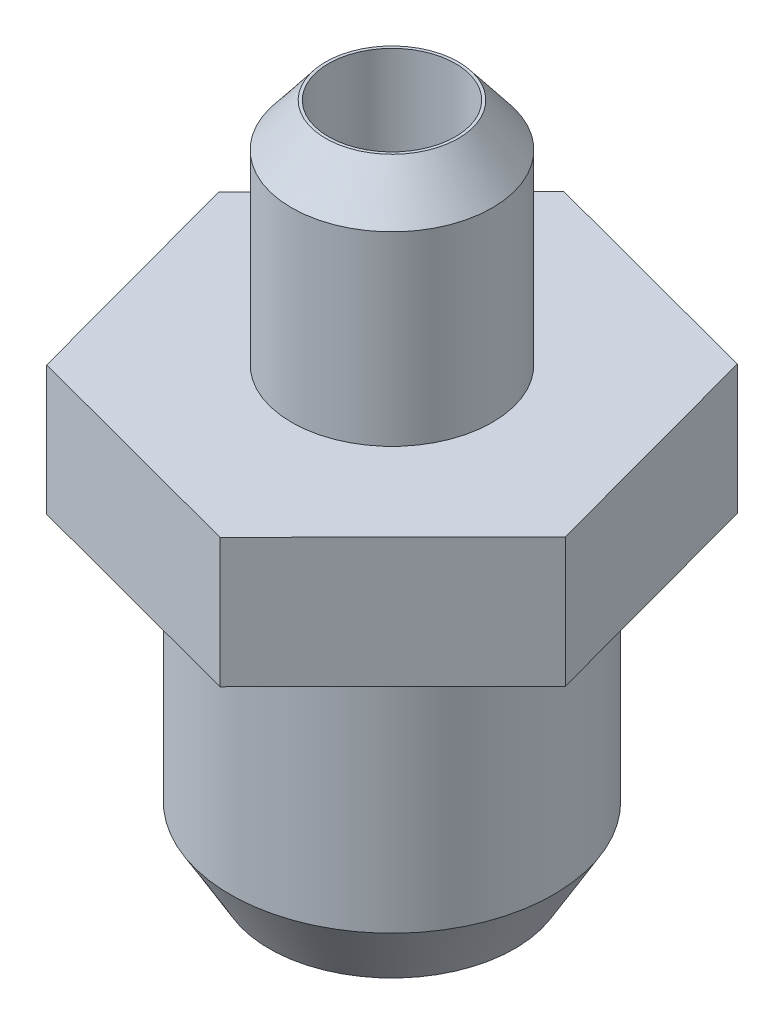
ISO-10303-21;
HEADER;
FILE_DESCRIPTION(('STEP AP214'),'2;1');
FILE_NAME('part.step','',(''),(''),'','','');
FILE_SCHEMA(('AUTOMOTIVE_DESIGN { 1 0 10303 214 1 1 1 1 }'));
ENDSEC;
DATA;
#1=APPLICATION_CONTEXT('core data for automotive mechanical design processes');
#2=APPLICATION_PROTOCOL_DEFINITION('international standard','automotive_design',2000,#1);
#3=PRODUCT_CONTEXT('',#1,'mechanical');
#4=PRODUCT('Part','Part','',(#3));
#5=PRODUCT_RELATED_PRODUCT_CATEGORY('part','',(#4));
#6=PRODUCT_DEFINITION_FORMATION('','',#4);
#7=PRODUCT_DEFINITION_CONTEXT('part definition',#1,'design');
#8=PRODUCT_DEFINITION('design','',#6,#7);
#9=PRODUCT_DEFINITION_SHAPE('','',#8);
#10=(LENGTH_UNIT() NAMED_UNIT(*) SI_UNIT(.MILLI.,.METRE.));
#11=(NAMED_UNIT(*) PLANE_ANGLE_UNIT() SI_UNIT($,.RADIAN.));
#12=(NAMED_UNIT(*) SI_UNIT($,.STERADIAN.) SOLID_ANGLE_UNIT());
#13=UNCERTAINTY_MEASURE_WITH_UNIT(LENGTH_MEASURE(1.E-05),#10,'distance_accuracy_value','');
#14=(GEOMETRIC_REPRESENTATION_CONTEXT(3) GLOBAL_UNCERTAINTY_ASSIGNED_CONTEXT((#13)) GLOBAL_UNIT_ASSIGNED_CONTEXT((#10,
#11,#12)) REPRESENTATION_CONTEXT('',''));
#15=CARTESIAN_POINT('',(0.,0.,0.));
#16=DIRECTION('',(0.,0.,1.));
#17=DIRECTION('',(1.,0.,0.));
#18=AXIS2_PLACEMENT_3D('',#15,#16,#17);
#19=CARTESIAN_POINT('',(0.,0.,0.));
#20=DIRECTION('',(0.,-1.,0.));
#21=DIRECTION('',(0.,0.,-1.));
#22=AXIS2_PLACEMENT_3D('',#19,#20,#21);
#23=PLANE('',#22);
#24=CARTESIAN_POINT('',(0.,0.,0.));
#25=DIRECTION('',(0.,1.,0.));
#26=DIRECTION('',(0.,0.,1.));
#27=AXIS2_PLACEMENT_3D('',#24,#25,#26);
#28=CIRCLE('',#27,3.82542068277805);
#29=CARTESIAN_POINT('',(0.,0.,3.82542068277805));
#30=VERTEX_POINT('',#29);
#31=EDGE_CURVE('E112',#30,#30,#28,.T.);
#32=ORIENTED_EDGE('',*,*,#31,.T.);
#33=EDGE_LOOP('',(#32));
#34=FACE_BOUND('',#33,.T.);
#35=CARTESIAN_POINT('',(0.,0.,0.));
#36=DIRECTION('',(0.,-1.,0.));
#37=DIRECTION('',(0.,0.,-1.));
#38=AXIS2_PLACEMENT_3D('',#35,#36,#37);
#39=CIRCLE('',#38,7.4);
#40=CARTESIAN_POINT('',(0.,0.,-7.4));
#41=VERTEX_POINT('',#40);
#42=EDGE_CURVE('E11',#41,#41,#39,.T.);
#43=ORIENTED_EDGE('',*,*,#42,.T.);
#44=EDGE_LOOP('',(#43));
#45=FACE_BOUND('',#44,.T.);
#46=ADVANCED_FACE('F34',(#34,#45),#23,.T.);
#47=CARTESIAN_POINT('',(0.,0.,0.));
#48=DIRECTION('',(0.,1.,0.));
#49=DIRECTION('',(0.,0.,1.));
#50=AXIS2_PLACEMENT_3D('',#47,#48,#49);
#51=CONICAL_SURFACE('',#50,7.4,0.531177619225765);
#52=CARTESIAN_POINT('',(0.,4.,0.));
#53=DIRECTION('',(0.,-1.,0.));
#54=DIRECTION('',(0.,0.,-1.));
#55=AXIS2_PLACEMENT_3D('',#52,#53,#54);
#56=CIRCLE('',#55,9.75);
#57=CARTESIAN_POINT('',(0.,4.,-9.75));
#58=VERTEX_POINT('',#57);
#59=EDGE_CURVE('E42',#58,#58,#56,.T.);
#60=ORIENTED_EDGE('',*,*,#59,.T.);
#61=EDGE_LOOP('',(#60));
#62=FACE_BOUND('',#61,.T.);
#63=ORIENTED_EDGE('',*,*,#42,.F.);
#64=EDGE_LOOP('',(#63));
#65=FACE_BOUND('',#64,.T.);
#66=ADVANCED_FACE('F150',(#62,#65),#51,.T.);
#67=CARTESIAN_POINT('',(0.,0.,0.));
#68=DIRECTION('',(0.,-1.,0.));
#69=DIRECTION('',(0.,0.,-1.));
#70=AXIS2_PLACEMENT_3D('',#67,#68,#69);
#71=CYLINDRICAL_SURFACE('',#70,9.75);
#72=CARTESIAN_POINT('',(0.,19.,0.));
#73=DIRECTION('',(0.,-1.,0.));
#74=DIRECTION('',(0.,0.,-1.));
#75=AXIS2_PLACEMENT_3D('',#72,#73,#74);
#76=CIRCLE('',#75,9.75);
#77=CARTESIAN_POINT('',(0.,19.,-9.75));
#78=VERTEX_POINT('',#77);
#79=EDGE_CURVE('E145',#78,#78,#76,.T.);
#80=ORIENTED_EDGE('',*,*,#79,.T.);
#81=EDGE_LOOP('',(#80));
#82=FACE_BOUND('',#81,.T.);
#83=ORIENTED_EDGE('',*,*,#59,.F.);
#84=EDGE_LOOP('',(#83));
#85=FACE_BOUND('',#84,.T.);
#86=ADVANCED_FACE('F153',(#82,#85),#71,.T.);
#87=CARTESIAN_POINT('',(9.75,19.,0.));
#88=DIRECTION('',(0.,-1.,0.));
#89=DIRECTION('',(0.,0.,-1.));
#90=AXIS2_PLACEMENT_3D('',#87,#88,#89);
#91=PLANE('',#90);
#92=ORIENTED_EDGE('',*,*,#79,.F.);
#93=EDGE_LOOP('',(#92));
#94=FACE_BOUND('',#93,.T.);
#95=DIRECTION('',(0.705531439417221,0.,-0.70867862109271));
#96=VECTOR('',#95,1.);
#97=CARTESIAN_POINT('',(3.84084877233336,19.,14.2076961316563));
#98=LINE('',#97,#96);
#99=CARTESIAN_POINT('',(3.84084877233336,19.,14.2076961316563));
#100=VERTEX_POINT('',#99);
#101=CARTESIAN_POINT('',(14.2246501654309,19.,3.77757545689316));
#102=VERTEX_POINT('',#101);
#103=EDGE_CURVE('E118',#100,#102,#98,.T.);
#104=ORIENTED_EDGE('',*,*,#103,.F.);
#105=DIRECTION('',(0.966499408693824,0.,0.256668839157561));
#106=VECTOR('',#105,1.);
#107=CARTESIAN_POINT('',(-10.3838013930975,19.,10.4301206747631));
#108=LINE('',#107,#106);
#109=CARTESIAN_POINT('',(-10.3838013930975,19.,10.4301206747631));
#110=VERTEX_POINT('',#109);
#111=EDGE_CURVE('E121',#110,#100,#108,.T.);
#112=ORIENTED_EDGE('',*,*,#111,.F.);
#113=DIRECTION('',(0.260967969276602,0.,0.96534746025027));
#114=VECTOR('',#113,1.);
#115=CARTESIAN_POINT('',(-14.2246501654309,19.,-3.77757545689317));
#116=LINE('',#115,#114);
#117=CARTESIAN_POINT('',(-14.2246501654309,19.,-3.77757545689317));
#118=VERTEX_POINT('',#117);
#119=EDGE_CURVE('E125',#118,#110,#116,.T.);
#120=ORIENTED_EDGE('',*,*,#119,.F.);
#121=DIRECTION('',(-0.705531439417221,0.,0.70867862109271));
#122=VECTOR('',#121,1.);
#123=CARTESIAN_POINT('',(-3.84084877233336,19.,-14.2076961316563));
#124=LINE('',#123,#122);
#125=CARTESIAN_POINT('',(-3.84084877233336,19.,-14.2076961316563));
#126=VERTEX_POINT('',#125);
#127=EDGE_CURVE('E73',#126,#118,#124,.T.);
#128=ORIENTED_EDGE('',*,*,#127,.F.);
#129=DIRECTION('',(-0.966499408693824,0.,-0.25666883915756));
#130=VECTOR('',#129,1.);
#131=CARTESIAN_POINT('',(10.3838013930975,19.,-10.4301206747631));
#132=LINE('',#131,#130);
#133=CARTESIAN_POINT('',(10.3838013930975,19.,-10.4301206747631));
#134=VERTEX_POINT('',#133);
#135=EDGE_CURVE('E78',#134,#126,#132,.T.);
#136=ORIENTED_EDGE('',*,*,#135,.F.);
#137=DIRECTION('',(-0.260967969276603,0.,-0.96534746025027));
#138=VECTOR('',#137,1.);
#139=CARTESIAN_POINT('',(14.2246501654309,19.,3.77757545689316));
#140=LINE('',#139,#138);
#141=EDGE_CURVE('E99',#102,#134,#140,.T.);
#142=ORIENTED_EDGE('',*,*,#141,.F.);
#143=EDGE_LOOP('',(#104,#112,#120,#128,#136,#142));
#144=FACE_BOUND('',#143,.T.);
#145=ADVANCED_FACE('F155',(#94,#144),#91,.T.);
#146=CARTESIAN_POINT('',(14.2246501654309,-21.2094168919856,3.77757545689316));
#147=DIRECTION('',(0.96534746025027,0.,-0.260967969276602));
#148=DIRECTION('',(-0.260967969276603,0.,-0.96534746025027));
#149=AXIS2_PLACEMENT_3D('',#146,#147,#148);
#150=PLANE('',#149);
#151=DIRECTION('',(0.,1.,0.));
#152=VECTOR('',#151,1.);
#153=CARTESIAN_POINT('',(14.2246501654309,-21.2094168919856,3.77757545689316));
#154=LINE('',#153,#152);
#155=CARTESIAN_POINT('',(14.2246501654309,26.8,3.77757545689316));
#156=VERTEX_POINT('',#155);
#157=EDGE_CURVE('E50',#102,#156,#154,.T.);
#158=ORIENTED_EDGE('',*,*,#157,.F.);
#159=ORIENTED_EDGE('',*,*,#141,.T.);
#160=DIRECTION('',(0.,1.,0.));
#161=VECTOR('',#160,1.);
#162=CARTESIAN_POINT('',(10.3838013930975,-21.2094168919856,-10.4301206747631));
#163=LINE('',#162,#161);
#164=CARTESIAN_POINT('',(10.3838013930975,26.8,-10.4301206747631));
#165=VERTEX_POINT('',#164);
#166=EDGE_CURVE('E94',#134,#165,#163,.T.);
#167=ORIENTED_EDGE('',*,*,#166,.T.);
#168=DIRECTION('',(-0.260967969276602,0.,-0.96534746025027));
#169=VECTOR('',#168,1.);
#170=CARTESIAN_POINT('',(14.2246501654309,26.8,3.77757545689316));
#171=LINE('',#170,#169);
#172=EDGE_CURVE('E97',#156,#165,#171,.T.);
#173=ORIENTED_EDGE('',*,*,#172,.F.);
#174=EDGE_LOOP('',(#158,#159,#167,#173));
#175=FACE_BOUND('',#174,.T.);
#176=ADVANCED_FACE('F95',(#175),#150,.T.);
#177=CARTESIAN_POINT('',(10.3838013930975,-21.2094168919856,-10.4301206747631));
#178=DIRECTION('',(0.25666883915756,0.,-0.966499408693823));
#179=DIRECTION('',(-0.966499408693824,0.,-0.25666883915756));
#180=AXIS2_PLACEMENT_3D('',#177,#178,#179);
#181=PLANE('',#180);
#182=ORIENTED_EDGE('',*,*,#166,.F.);
#183=ORIENTED_EDGE('',*,*,#135,.T.);
#184=DIRECTION('',(0.,1.,0.));
#185=VECTOR('',#184,1.);
#186=CARTESIAN_POINT('',(-3.84084877233336,-21.2094168919856,-14.2076961316563));
#187=LINE('',#186,#185);
#188=CARTESIAN_POINT('',(-3.84084877233336,26.8,-14.2076961316563));
#189=VERTEX_POINT('',#188);
#190=EDGE_CURVE('E89',#126,#189,#187,.T.);
#191=ORIENTED_EDGE('',*,*,#190,.T.);
#192=DIRECTION('',(-0.966499408693824,0.,-0.25666883915756));
#193=VECTOR('',#192,1.);
#194=CARTESIAN_POINT('',(10.3838013930975,26.8,-10.4301206747631));
#195=LINE('',#194,#193);
#196=EDGE_CURVE('E102',#165,#189,#195,.T.);
#197=ORIENTED_EDGE('',*,*,#196,.F.);
#198=EDGE_LOOP('',(#182,#183,#191,#197));
#199=FACE_BOUND('',#198,.T.);
#200=ADVANCED_FACE('F103',(#199),#181,.T.);
#201=CARTESIAN_POINT('',(-3.84084877233336,-21.2094168919856,-14.2076961316563));
#202=DIRECTION('',(-0.70867862109271,0.,-0.705531439417221));
#203=DIRECTION('',(-0.705531439417221,0.,0.70867862109271));
#204=AXIS2_PLACEMENT_3D('',#201,#202,#203);
#205=PLANE('',#204);
#206=ORIENTED_EDGE('',*,*,#190,.F.);
#207=ORIENTED_EDGE('',*,*,#127,.T.);
#208=DIRECTION('',(0.,1.,0.));
#209=VECTOR('',#208,1.);
#210=CARTESIAN_POINT('',(-14.2246501654309,-21.2094168919856,-3.77757545689317));
#211=LINE('',#210,#209);
#212=CARTESIAN_POINT('',(-14.2246501654309,26.8,-3.77757545689317));
#213=VERTEX_POINT('',#212);
#214=EDGE_CURVE('E128',#118,#213,#211,.T.);
#215=ORIENTED_EDGE('',*,*,#214,.T.);
#216=DIRECTION('',(-0.705531439417221,0.,0.70867862109271));
#217=VECTOR('',#216,1.);
#218=CARTESIAN_POINT('',(-3.84084877233336,26.8,-14.2076961316563));
#219=LINE('',#218,#217);
#220=EDGE_CURVE('E106',#189,#213,#219,.T.);
#221=ORIENTED_EDGE('',*,*,#220,.F.);
#222=EDGE_LOOP('',(#206,#207,#215,#221));
#223=FACE_BOUND('',#222,.T.);
#224=ADVANCED_FACE('F184',(#223),#205,.T.);
#225=CARTESIAN_POINT('',(-14.2246501654309,-21.2094168919856,-3.77757545689317));
#226=DIRECTION('',(-0.96534746025027,0.,0.260967969276602));
#227=DIRECTION('',(0.260967969276602,0.,0.96534746025027));
#228=AXIS2_PLACEMENT_3D('',#225,#226,#227);
#229=PLANE('',#228);
#230=ORIENTED_EDGE('',*,*,#214,.F.);
#231=ORIENTED_EDGE('',*,*,#119,.T.);
#232=DIRECTION('',(0.,1.,0.));
#233=VECTOR('',#232,1.);
#234=CARTESIAN_POINT('',(-10.3838013930975,-21.2094168919856,10.4301206747631));
#235=LINE('',#234,#233);
#236=CARTESIAN_POINT('',(-10.3838013930975,26.8,10.4301206747631));
#237=VERTEX_POINT('',#236);
#238=EDGE_CURVE('E124',#110,#237,#235,.T.);
#239=ORIENTED_EDGE('',*,*,#238,.T.);
#240=DIRECTION('',(0.260967969276602,0.,0.96534746025027));
#241=VECTOR('',#240,1.);
#242=CARTESIAN_POINT('',(-14.2246501654309,26.8,-3.77757545689317));
#243=LINE('',#242,#241);
#244=EDGE_CURVE('E179',#213,#237,#243,.T.);
#245=ORIENTED_EDGE('',*,*,#244,.F.);
#246=EDGE_LOOP('',(#230,#231,#239,#245));
#247=FACE_BOUND('',#246,.T.);
#248=ADVANCED_FACE('F187',(#247),#229,.T.);
#249=CARTESIAN_POINT('',(-10.3838013930975,-21.2094168919856,10.4301206747631));
#250=DIRECTION('',(-0.256668839157561,0.,0.966499408693823));
#251=DIRECTION('',(0.966499408693824,0.,0.256668839157561));
#252=AXIS2_PLACEMENT_3D('',#249,#250,#251);
#253=PLANE('',#252);
#254=ORIENTED_EDGE('',*,*,#238,.F.);
#255=ORIENTED_EDGE('',*,*,#111,.T.);
#256=DIRECTION('',(0.,1.,0.));
#257=VECTOR('',#256,1.);
#258=CARTESIAN_POINT('',(3.84084877233336,-21.2094168919856,14.2076961316563));
#259=LINE('',#258,#257);
#260=CARTESIAN_POINT('',(3.84084877233336,26.8,14.2076961316563));
#261=VERTEX_POINT('',#260);
#262=EDGE_CURVE('E120',#100,#261,#259,.T.);
#263=ORIENTED_EDGE('',*,*,#262,.T.);
#264=DIRECTION('',(0.966499408693823,0.,0.256668839157561));
#265=VECTOR('',#264,1.);
#266=CARTESIAN_POINT('',(-10.3838013930975,26.8,10.4301206747631));
#267=LINE('',#266,#265);
#268=EDGE_CURVE('E117',#237,#261,#267,.T.);
#269=ORIENTED_EDGE('',*,*,#268,.F.);
#270=EDGE_LOOP('',(#254,#255,#263,#269));
#271=FACE_BOUND('',#270,.T.);
#272=ADVANCED_FACE('F190',(#271),#253,.T.);
#273=CARTESIAN_POINT('',(3.84084877233336,-21.2094168919856,14.2076961316563));
#274=DIRECTION('',(0.70867862109271,0.,0.705531439417221));
#275=DIRECTION('',(0.705531439417221,0.,-0.70867862109271));
#276=AXIS2_PLACEMENT_3D('',#273,#274,#275);
#277=PLANE('',#276);
#278=ORIENTED_EDGE('',*,*,#262,.F.);
#279=ORIENTED_EDGE('',*,*,#103,.T.);
#280=ORIENTED_EDGE('',*,*,#157,.T.);
#281=DIRECTION('',(0.705531439417221,0.,-0.70867862109271));
#282=VECTOR('',#281,1.);
#283=CARTESIAN_POINT('',(3.84084877233336,26.8,14.2076961316563));
#284=LINE('',#283,#282);
#285=EDGE_CURVE('E110',#261,#156,#284,.T.);
#286=ORIENTED_EDGE('',*,*,#285,.F.);
#287=EDGE_LOOP('',(#278,#279,#280,#286));
#288=FACE_BOUND('',#287,.T.);
#289=ADVANCED_FACE('F192',(#288),#277,.T.);
#290=CARTESIAN_POINT('',(0.,40.6,0.));
#291=DIRECTION('',(0.,1.,0.));
#292=DIRECTION('',(0.,0.,1.));
#293=AXIS2_PLACEMENT_3D('',#290,#291,#292);
#294=PLANE('',#293);
#295=CARTESIAN_POINT('',(0.,40.6,0.));
#296=DIRECTION('',(0.,1.,0.));
#297=DIRECTION('',(0.,0.,1.));
#298=AXIS2_PLACEMENT_3D('',#295,#296,#297);
#299=CIRCLE('',#298,3.82542068277805);
#300=CARTESIAN_POINT('',(0.,40.6,3.82542068277805));
#301=VERTEX_POINT('',#300);
#302=EDGE_CURVE('E173',#301,#301,#299,.T.);
#303=ORIENTED_EDGE('',*,*,#302,.F.);
#304=EDGE_LOOP('',(#303));
#305=FACE_BOUND('',#304,.T.);
#306=CARTESIAN_POINT('',(0.,40.6,0.));
#307=DIRECTION('',(0.,-1.,0.));
#308=DIRECTION('',(0.,0.,-1.));
#309=AXIS2_PLACEMENT_3D('',#306,#307,#308);
#310=CIRCLE('',#309,4.);
#311=CARTESIAN_POINT('',(0.,40.6,-4.));
#312=VERTEX_POINT('',#311);
#313=EDGE_CURVE('E136',#312,#312,#310,.T.);
#314=ORIENTED_EDGE('',*,*,#313,.F.);
#315=EDGE_LOOP('',(#314));
#316=FACE_BOUND('',#315,.T.);
#317=ADVANCED_FACE('F194',(#305,#316),#294,.T.);
#318=CARTESIAN_POINT('',(0.,38.,0.));
#319=DIRECTION('',(0.,-1.,0.));
#320=DIRECTION('',(0.,0.,-1.));
#321=AXIS2_PLACEMENT_3D('',#318,#319,#320);
#322=CONICAL_SURFACE('',#321,6.05,0.667665588593354);
#323=ORIENTED_EDGE('',*,*,#313,.T.);
#324=EDGE_LOOP('',(#323));
#325=FACE_BOUND('',#324,.T.);
#326=CARTESIAN_POINT('',(0.,38.,0.));
#327=DIRECTION('',(0.,-1.,0.));
#328=DIRECTION('',(0.,0.,-1.));
#329=AXIS2_PLACEMENT_3D('',#326,#327,#328);
#330=CIRCLE('',#329,6.05);
#331=CARTESIAN_POINT('',(0.,38.,-6.05));
#332=VERTEX_POINT('',#331);
#333=EDGE_CURVE('E139',#332,#332,#330,.T.);
#334=ORIENTED_EDGE('',*,*,#333,.F.);
#335=EDGE_LOOP('',(#334));
#336=FACE_BOUND('',#335,.T.);
#337=ADVANCED_FACE('F200',(#325,#336),#322,.T.);
#338=CARTESIAN_POINT('',(0.,0.,0.));
#339=DIRECTION('',(0.,-1.,0.));
#340=DIRECTION('',(0.,0.,-1.));
#341=AXIS2_PLACEMENT_3D('',#338,#339,#340);
#342=CYLINDRICAL_SURFACE('',#341,6.05);
#343=ORIENTED_EDGE('',*,*,#333,.T.);
#344=EDGE_LOOP('',(#343));
#345=FACE_BOUND('',#344,.T.);
#346=CARTESIAN_POINT('',(0.,26.8,0.));
#347=DIRECTION('',(0.,-1.,0.));
#348=DIRECTION('',(0.,0.,-1.));
#349=AXIS2_PLACEMENT_3D('',#346,#347,#348);
#350=CIRCLE('',#349,6.05);
#351=CARTESIAN_POINT('',(0.,26.8,-6.05));
#352=VERTEX_POINT('',#351);
#353=EDGE_CURVE('E142',#352,#352,#350,.T.);
#354=ORIENTED_EDGE('',*,*,#353,.F.);
#355=EDGE_LOOP('',(#354));
#356=FACE_BOUND('',#355,.T.);
#357=ADVANCED_FACE('F217',(#345,#356),#342,.T.);
#358=CARTESIAN_POINT('',(12.7,26.8,0.));
#359=DIRECTION('',(0.,1.,0.));
#360=DIRECTION('',(0.,0.,1.));
#361=AXIS2_PLACEMENT_3D('',#358,#359,#360);
#362=PLANE('',#361);
#363=ORIENTED_EDGE('',*,*,#353,.T.);
#364=EDGE_LOOP('',(#363));
#365=FACE_BOUND('',#364,.T.);
#366=ORIENTED_EDGE('',*,*,#285,.T.);
#367=ORIENTED_EDGE('',*,*,#172,.T.);
#368=ORIENTED_EDGE('',*,*,#196,.T.);
#369=ORIENTED_EDGE('',*,*,#220,.T.);
#370=ORIENTED_EDGE('',*,*,#244,.T.);
#371=ORIENTED_EDGE('',*,*,#268,.T.);
#372=EDGE_LOOP('',(#366,#367,#368,#369,#370,#371));
#373=FACE_BOUND('',#372,.T.);
#374=ADVANCED_FACE('F108',(#365,#373),#362,.T.);
#375=CARTESIAN_POINT('',(0.,0.,0.));
#376=DIRECTION('',(0.,1.,0.));
#377=DIRECTION('',(0.,0.,1.));
#378=AXIS2_PLACEMENT_3D('',#375,#376,#377);
#379=CYLINDRICAL_SURFACE('',#378,3.82542068277805);
#380=ORIENTED_EDGE('',*,*,#31,.F.);
#381=EDGE_LOOP('',(#380));
#382=FACE_BOUND('',#381,.T.);
#383=ORIENTED_EDGE('',*,*,#302,.T.);
#384=EDGE_LOOP('',(#383));
#385=FACE_BOUND('',#384,.T.);
#386=ADVANCED_FACE('F205',(#382,#385),#379,.F.);
#387=CLOSED_SHELL('',(#46,#66,#86,#145,#176,#200,#224,#248,#272,#289,#317,#337,#357,#374,#386));
#388=MANIFOLD_SOLID_BREP('B2',#387);
#389=ADVANCED_BREP_SHAPE_REPRESENTATION('',(#18,#388),#14);
#390=SHAPE_DEFINITION_REPRESENTATION(#9,#389);
ENDSEC;
END-ISO-10303-21;
